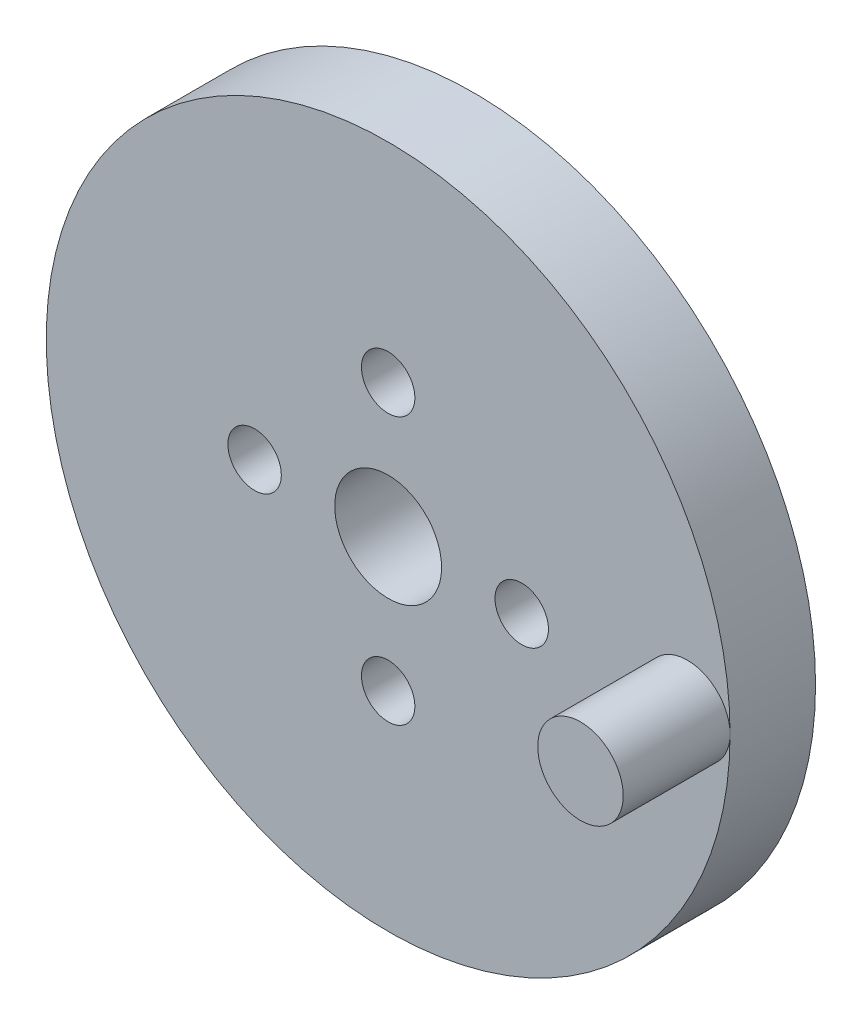
ISO-10303-21;
HEADER;
FILE_DESCRIPTION(('STEP AP214'),'2;1');
FILE_NAME('part.step','',(''),(''),'','','');
FILE_SCHEMA(('AUTOMOTIVE_DESIGN { 1 0 10303 214 1 1 1 1 }'));
ENDSEC;
DATA;
#1=APPLICATION_CONTEXT('core data for automotive mechanical design processes');
#2=APPLICATION_PROTOCOL_DEFINITION('international standard','automotive_design',2000,#1);
#3=PRODUCT_CONTEXT('',#1,'mechanical');
#4=PRODUCT('Part','Part','',(#3));
#5=PRODUCT_RELATED_PRODUCT_CATEGORY('part','',(#4));
#6=PRODUCT_DEFINITION_FORMATION('','',#4);
#7=PRODUCT_DEFINITION_CONTEXT('part definition',#1,'design');
#8=PRODUCT_DEFINITION('design','',#6,#7);
#9=PRODUCT_DEFINITION_SHAPE('','',#8);
#10=(LENGTH_UNIT() NAMED_UNIT(*) SI_UNIT(.MILLI.,.METRE.));
#11=(NAMED_UNIT(*) PLANE_ANGLE_UNIT() SI_UNIT($,.RADIAN.));
#12=(NAMED_UNIT(*) SI_UNIT($,.STERADIAN.) SOLID_ANGLE_UNIT());
#13=UNCERTAINTY_MEASURE_WITH_UNIT(LENGTH_MEASURE(1.E-05),#10,'distance_accuracy_value','');
#14=(GEOMETRIC_REPRESENTATION_CONTEXT(3) GLOBAL_UNCERTAINTY_ASSIGNED_CONTEXT((#13)) GLOBAL_UNIT_ASSIGNED_CONTEXT((#10,
#11,#12)) REPRESENTATION_CONTEXT('',''));
#15=CARTESIAN_POINT('',(0.,0.,0.));
#16=DIRECTION('',(0.,0.,1.));
#17=DIRECTION('',(1.,0.,0.));
#18=AXIS2_PLACEMENT_3D('',#15,#16,#17);
#19=CARTESIAN_POINT('',(0.,0.,8.));
#20=DIRECTION('',(0.,0.,1.));
#21=DIRECTION('',(1.,0.,0.));
#22=AXIS2_PLACEMENT_3D('',#19,#20,#21);
#23=PLANE('',#22);
#24=CARTESIAN_POINT('',(-12.5,0.,8.));
#25=DIRECTION('',(0.,0.,1.));
#26=DIRECTION('',(1.,0.,0.));
#27=AXIS2_PLACEMENT_3D('',#24,#25,#26);
#28=CIRCLE('',#27,2.5);
#29=CARTESIAN_POINT('',(-10.,0.,8.));
#30=VERTEX_POINT('',#29);
#31=EDGE_CURVE('E92',#30,#30,#28,.T.);
#32=ORIENTED_EDGE('',*,*,#31,.F.);
#33=EDGE_LOOP('',(#32));
#34=FACE_BOUND('',#33,.T.);
#35=CARTESIAN_POINT('',(0.,-12.5,8.));
#36=DIRECTION('',(0.,0.,1.));
#37=DIRECTION('',(1.,0.,0.));
#38=AXIS2_PLACEMENT_3D('',#35,#36,#37);
#39=CIRCLE('',#38,2.5);
#40=CARTESIAN_POINT('',(2.50000000000004,-12.5,8.));
#41=VERTEX_POINT('',#40);
#42=EDGE_CURVE('E88',#41,#41,#39,.T.);
#43=ORIENTED_EDGE('',*,*,#42,.F.);
#44=EDGE_LOOP('',(#43));
#45=FACE_BOUND('',#44,.T.);
#46=CARTESIAN_POINT('',(12.5,0.,8.));
#47=DIRECTION('',(0.,0.,1.));
#48=DIRECTION('',(1.,0.,0.));
#49=AXIS2_PLACEMENT_3D('',#46,#47,#48);
#50=CIRCLE('',#49,2.5);
#51=CARTESIAN_POINT('',(15.,0.,8.));
#52=VERTEX_POINT('',#51);
#53=EDGE_CURVE('E84',#52,#52,#50,.T.);
#54=ORIENTED_EDGE('',*,*,#53,.F.);
#55=EDGE_LOOP('',(#54));
#56=FACE_BOUND('',#55,.T.);
#57=CARTESIAN_POINT('',(-1.30930550206618E-13,12.5,8.));
#58=DIRECTION('',(0.,0.,1.));
#59=DIRECTION('',(1.,0.,0.));
#60=AXIS2_PLACEMENT_3D('',#57,#58,#59);
#61=CIRCLE('',#60,2.5);
#62=CARTESIAN_POINT('',(2.49999999999987,12.5,8.));
#63=VERTEX_POINT('',#62);
#64=EDGE_CURVE('E69',#63,#63,#61,.T.);
#65=ORIENTED_EDGE('',*,*,#64,.F.);
#66=EDGE_LOOP('',(#65));
#67=FACE_BOUND('',#66,.T.);
#68=CARTESIAN_POINT('',(0.,0.,8.));
#69=DIRECTION('',(0.,0.,1.));
#70=DIRECTION('',(1.,0.,0.));
#71=AXIS2_PLACEMENT_3D('',#68,#69,#70);
#72=CIRCLE('',#71,32.);
#73=CARTESIAN_POINT('',(32.,0.,8.));
#74=VERTEX_POINT('',#73);
#75=EDGE_CURVE('E11',#74,#74,#72,.T.);
#76=ORIENTED_EDGE('',*,*,#75,.T.);
#77=CARTESIAN_POINT('',(28.,0.,8.));
#78=DIRECTION('',(0.,0.,1.));
#79=DIRECTION('',(1.,0.,0.));
#80=AXIS2_PLACEMENT_3D('',#77,#78,#79);
#81=CIRCLE('',#80,4.);
#82=EDGE_CURVE('E55',#74,#74,#81,.T.);
#83=ORIENTED_EDGE('',*,*,#82,.F.);
#84=EDGE_LOOP('',(#76,#83));
#85=FACE_BOUND('',#84,.T.);
#86=CARTESIAN_POINT('',(0.,0.,8.));
#87=DIRECTION('',(0.,0.,1.));
#88=DIRECTION('',(1.,0.,0.));
#89=AXIS2_PLACEMENT_3D('',#86,#87,#88);
#90=CIRCLE('',#89,5.);
#91=CARTESIAN_POINT('',(5.,0.,8.));
#92=VERTEX_POINT('',#91);
#93=EDGE_CURVE('E97',#92,#92,#90,.T.);
#94=ORIENTED_EDGE('',*,*,#93,.F.);
#95=EDGE_LOOP('',(#94));
#96=FACE_BOUND('',#95,.T.);
#97=ADVANCED_FACE('F39',(#34,#45,#56,#67,#85,#96),#23,.T.);
#98=CARTESIAN_POINT('',(0.,0.,0.));
#99=DIRECTION('',(0.,0.,1.));
#100=DIRECTION('',(1.,0.,0.));
#101=AXIS2_PLACEMENT_3D('',#98,#99,#100);
#102=PLANE('',#101);
#103=CARTESIAN_POINT('',(-12.5,0.,0.));
#104=DIRECTION('',(0.,0.,-1.));
#105=DIRECTION('',(-1.,0.,0.));
#106=AXIS2_PLACEMENT_3D('',#103,#104,#105);
#107=CIRCLE('',#106,2.5);
#108=CARTESIAN_POINT('',(-15.,0.,0.));
#109=VERTEX_POINT('',#108);
#110=EDGE_CURVE('E65',#109,#109,#107,.T.);
#111=ORIENTED_EDGE('',*,*,#110,.F.);
#112=EDGE_LOOP('',(#111));
#113=FACE_BOUND('',#112,.T.);
#114=CARTESIAN_POINT('',(0.,-12.5,0.));
#115=DIRECTION('',(0.,0.,-1.));
#116=DIRECTION('',(-1.,0.,0.));
#117=AXIS2_PLACEMENT_3D('',#114,#115,#116);
#118=CIRCLE('',#117,2.5);
#119=CARTESIAN_POINT('',(-2.49999999999996,-12.5,0.));
#120=VERTEX_POINT('',#119);
#121=EDGE_CURVE('E70',#120,#120,#118,.T.);
#122=ORIENTED_EDGE('',*,*,#121,.F.);
#123=EDGE_LOOP('',(#122));
#124=FACE_BOUND('',#123,.T.);
#125=CARTESIAN_POINT('',(12.5,0.,0.));
#126=DIRECTION('',(0.,0.,-1.));
#127=DIRECTION('',(-1.,0.,0.));
#128=AXIS2_PLACEMENT_3D('',#125,#126,#127);
#129=CIRCLE('',#128,2.5);
#130=CARTESIAN_POINT('',(10.,0.,0.));
#131=VERTEX_POINT('',#130);
#132=EDGE_CURVE('E74',#131,#131,#129,.T.);
#133=ORIENTED_EDGE('',*,*,#132,.F.);
#134=EDGE_LOOP('',(#133));
#135=FACE_BOUND('',#134,.T.);
#136=CARTESIAN_POINT('',(-1.30930550206618E-13,12.5,0.));
#137=DIRECTION('',(0.,0.,-1.));
#138=DIRECTION('',(-1.,0.,0.));
#139=AXIS2_PLACEMENT_3D('',#136,#137,#138);
#140=CIRCLE('',#139,2.5);
#141=CARTESIAN_POINT('',(-2.50000000000013,12.5,0.));
#142=VERTEX_POINT('',#141);
#143=EDGE_CURVE('E62',#142,#142,#140,.T.);
#144=ORIENTED_EDGE('',*,*,#143,.F.);
#145=EDGE_LOOP('',(#144));
#146=FACE_BOUND('',#145,.T.);
#147=CARTESIAN_POINT('',(0.,0.,0.));
#148=DIRECTION('',(0.,0.,1.));
#149=DIRECTION('',(1.,0.,0.));
#150=AXIS2_PLACEMENT_3D('',#147,#148,#149);
#151=CIRCLE('',#150,32.);
#152=CARTESIAN_POINT('',(32.,0.,0.));
#153=VERTEX_POINT('',#152);
#154=EDGE_CURVE('E43',#153,#153,#151,.T.);
#155=ORIENTED_EDGE('',*,*,#154,.F.);
#156=EDGE_LOOP('',(#155));
#157=FACE_BOUND('',#156,.T.);
#158=CARTESIAN_POINT('',(0.,0.,0.));
#159=DIRECTION('',(0.,0.,1.));
#160=DIRECTION('',(1.,0.,0.));
#161=AXIS2_PLACEMENT_3D('',#158,#159,#160);
#162=CIRCLE('',#161,5.);
#163=CARTESIAN_POINT('',(5.,0.,0.));
#164=VERTEX_POINT('',#163);
#165=EDGE_CURVE('E96',#164,#164,#162,.T.);
#166=ORIENTED_EDGE('',*,*,#165,.T.);
#167=EDGE_LOOP('',(#166));
#168=FACE_BOUND('',#167,.T.);
#169=ADVANCED_FACE('F105',(#113,#124,#135,#146,#157,#168),#102,.F.);
#170=CARTESIAN_POINT('',(0.,0.,8.));
#171=DIRECTION('',(0.,0.,-1.));
#172=DIRECTION('',(-1.,0.,0.));
#173=AXIS2_PLACEMENT_3D('',#170,#171,#172);
#174=CYLINDRICAL_SURFACE('',#173,32.);
#175=ORIENTED_EDGE('',*,*,#75,.F.);
#176=EDGE_LOOP('',(#175));
#177=FACE_BOUND('',#176,.T.);
#178=ORIENTED_EDGE('',*,*,#154,.T.);
#179=EDGE_LOOP('',(#178));
#180=FACE_BOUND('',#179,.T.);
#181=ADVANCED_FACE('F41',(#177,#180),#174,.T.);
#182=CARTESIAN_POINT('',(0.,0.,8.));
#183=DIRECTION('',(0.,0.,-1.));
#184=DIRECTION('',(-1.,0.,0.));
#185=AXIS2_PLACEMENT_3D('',#182,#183,#184);
#186=CYLINDRICAL_SURFACE('',#185,5.);
#187=ORIENTED_EDGE('',*,*,#93,.T.);
#188=EDGE_LOOP('',(#187));
#189=FACE_BOUND('',#188,.T.);
#190=ORIENTED_EDGE('',*,*,#165,.F.);
#191=EDGE_LOOP('',(#190));
#192=FACE_BOUND('',#191,.T.);
#193=ADVANCED_FACE('F107',(#189,#192),#186,.F.);
#194=CARTESIAN_POINT('',(-1.30930550206618E-13,12.5,10.));
#195=DIRECTION('',(0.,0.,-1.));
#196=DIRECTION('',(-1.,0.,0.));
#197=AXIS2_PLACEMENT_3D('',#194,#195,#196);
#198=CYLINDRICAL_SURFACE('',#197,2.5);
#199=ORIENTED_EDGE('',*,*,#64,.T.);
#200=EDGE_LOOP('',(#199));
#201=FACE_BOUND('',#200,.T.);
#202=ORIENTED_EDGE('',*,*,#143,.T.);
#203=EDGE_LOOP('',(#202));
#204=FACE_BOUND('',#203,.T.);
#205=ADVANCED_FACE('F109',(#201,#204),#198,.F.);
#206=CARTESIAN_POINT('',(12.5,0.,10.));
#207=DIRECTION('',(0.,0.,-1.));
#208=DIRECTION('',(-1.,0.,0.));
#209=AXIS2_PLACEMENT_3D('',#206,#207,#208);
#210=CYLINDRICAL_SURFACE('',#209,2.5);
#211=ORIENTED_EDGE('',*,*,#53,.T.);
#212=EDGE_LOOP('',(#211));
#213=FACE_BOUND('',#212,.T.);
#214=ORIENTED_EDGE('',*,*,#132,.T.);
#215=EDGE_LOOP('',(#214));
#216=FACE_BOUND('',#215,.T.);
#217=ADVANCED_FACE('F116',(#213,#216),#210,.F.);
#218=CARTESIAN_POINT('',(0.,-12.5,10.));
#219=DIRECTION('',(0.,0.,-1.));
#220=DIRECTION('',(-1.,0.,0.));
#221=AXIS2_PLACEMENT_3D('',#218,#219,#220);
#222=CYLINDRICAL_SURFACE('',#221,2.5);
#223=ORIENTED_EDGE('',*,*,#42,.T.);
#224=EDGE_LOOP('',(#223));
#225=FACE_BOUND('',#224,.T.);
#226=ORIENTED_EDGE('',*,*,#121,.T.);
#227=EDGE_LOOP('',(#226));
#228=FACE_BOUND('',#227,.T.);
#229=ADVANCED_FACE('F143',(#225,#228),#222,.F.);
#230=CARTESIAN_POINT('',(-12.5,0.,10.));
#231=DIRECTION('',(0.,0.,-1.));
#232=DIRECTION('',(-1.,0.,0.));
#233=AXIS2_PLACEMENT_3D('',#230,#231,#232);
#234=CYLINDRICAL_SURFACE('',#233,2.5);
#235=ORIENTED_EDGE('',*,*,#31,.T.);
#236=EDGE_LOOP('',(#235));
#237=FACE_BOUND('',#236,.T.);
#238=ORIENTED_EDGE('',*,*,#110,.T.);
#239=EDGE_LOOP('',(#238));
#240=FACE_BOUND('',#239,.T.);
#241=ADVANCED_FACE('F150',(#237,#240),#234,.F.);
#242=CARTESIAN_POINT('',(28.,0.,18.));
#243=DIRECTION('',(0.,0.,-1.));
#244=DIRECTION('',(-1.,0.,0.));
#245=AXIS2_PLACEMENT_3D('',#242,#243,#244);
#246=CYLINDRICAL_SURFACE('',#245,4.);
#247=CARTESIAN_POINT('',(28.,0.,18.));
#248=DIRECTION('',(0.,0.,1.));
#249=DIRECTION('',(1.,0.,0.));
#250=AXIS2_PLACEMENT_3D('',#247,#248,#249);
#251=CIRCLE('',#250,4.);
#252=CARTESIAN_POINT('',(32.,0.,18.));
#253=VERTEX_POINT('',#252);
#254=EDGE_CURVE('E58',#253,#253,#251,.T.);
#255=ORIENTED_EDGE('',*,*,#254,.F.);
#256=EDGE_LOOP('',(#255));
#257=FACE_BOUND('',#256,.T.);
#258=ORIENTED_EDGE('',*,*,#82,.T.);
#259=EDGE_LOOP('',(#258));
#260=FACE_BOUND('',#259,.T.);
#261=ADVANCED_FACE('F156',(#257,#260),#246,.T.);
#262=CARTESIAN_POINT('',(28.,0.,18.));
#263=DIRECTION('',(0.,0.,1.));
#264=DIRECTION('',(1.,0.,0.));
#265=AXIS2_PLACEMENT_3D('',#262,#263,#264);
#266=PLANE('',#265);
#267=ORIENTED_EDGE('',*,*,#254,.T.);
#268=EDGE_LOOP('',(#267));
#269=FACE_BOUND('',#268,.T.);
#270=ADVANCED_FACE('F160',(#269),#266,.T.);
#271=CLOSED_SHELL('',(#97,#169,#181,#193,#205,#217,#229,#241,#261,#270));
#272=MANIFOLD_SOLID_BREP('B2',#271);
#273=ADVANCED_BREP_SHAPE_REPRESENTATION('',(#18,#272),#14);
#274=SHAPE_DEFINITION_REPRESENTATION(#9,#273);
ENDSEC;
END-ISO-10303-21;
